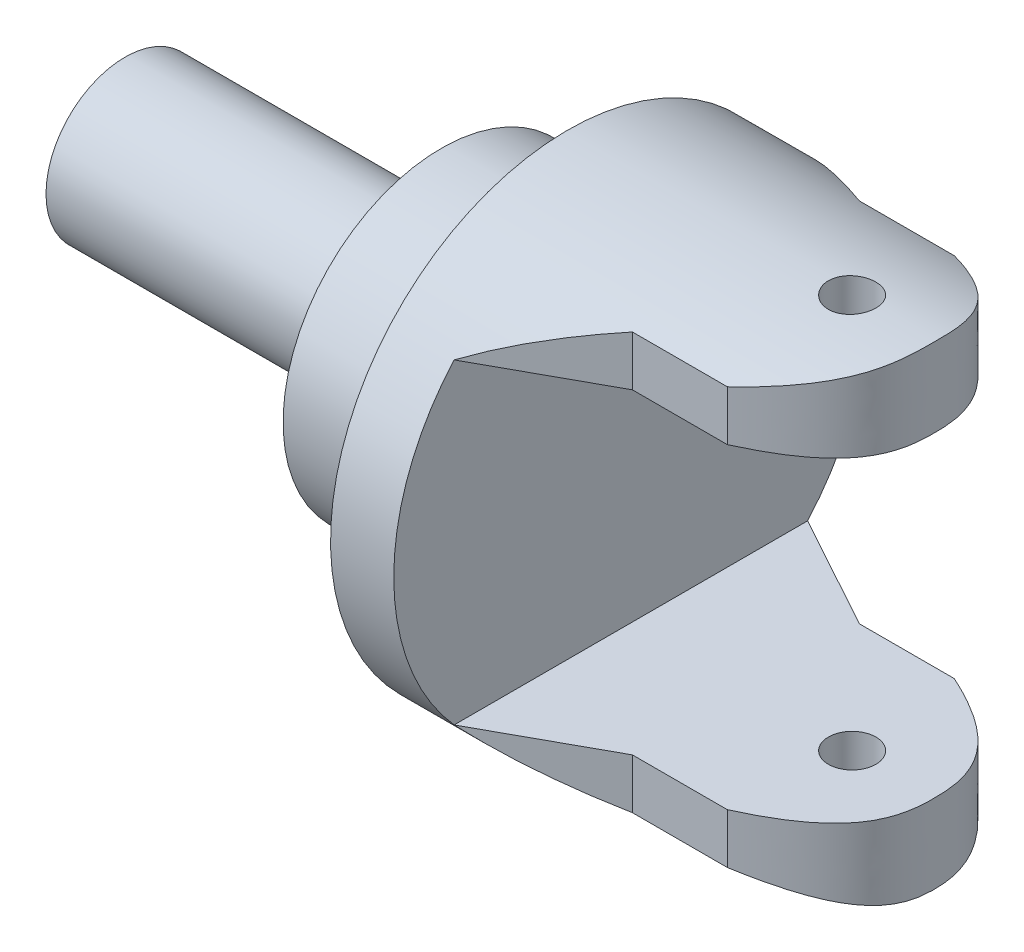
ISO-10303-21;
HEADER;
FILE_DESCRIPTION(('STEP AP214'),'2;1');
FILE_NAME('part.step','',(''),(''),'','','');
FILE_SCHEMA(('AUTOMOTIVE_DESIGN { 1 0 10303 214 1 1 1 1 }'));
ENDSEC;
DATA;
#1=APPLICATION_CONTEXT('core data for automotive mechanical design processes');
#2=APPLICATION_PROTOCOL_DEFINITION('international standard','automotive_design',2000,#1);
#3=PRODUCT_CONTEXT('',#1,'mechanical');
#4=PRODUCT('Part','Part','',(#3));
#5=PRODUCT_RELATED_PRODUCT_CATEGORY('part','',(#4));
#6=PRODUCT_DEFINITION_FORMATION('','',#4);
#7=PRODUCT_DEFINITION_CONTEXT('part definition',#1,'design');
#8=PRODUCT_DEFINITION('design','',#6,#7);
#9=PRODUCT_DEFINITION_SHAPE('','',#8);
#10=(LENGTH_UNIT() NAMED_UNIT(*) SI_UNIT(.MILLI.,.METRE.));
#11=(NAMED_UNIT(*) PLANE_ANGLE_UNIT() SI_UNIT($,.RADIAN.));
#12=(NAMED_UNIT(*) SI_UNIT($,.STERADIAN.) SOLID_ANGLE_UNIT());
#13=UNCERTAINTY_MEASURE_WITH_UNIT(LENGTH_MEASURE(1.E-05),#10,'distance_accuracy_value','');
#14=(GEOMETRIC_REPRESENTATION_CONTEXT(3) GLOBAL_UNCERTAINTY_ASSIGNED_CONTEXT((#13)) GLOBAL_UNIT_ASSIGNED_CONTEXT((#10,
#11,#12)) REPRESENTATION_CONTEXT('',''));
#15=CARTESIAN_POINT('',(0.,0.,0.));
#16=DIRECTION('',(0.,0.,1.));
#17=DIRECTION('',(1.,0.,0.));
#18=AXIS2_PLACEMENT_3D('',#15,#16,#17);
#19=CARTESIAN_POINT('',(4.,0.,0.));
#20=DIRECTION('',(-1.,0.,0.));
#21=DIRECTION('',(0.,0.,1.));
#22=AXIS2_PLACEMENT_3D('',#19,#20,#21);
#23=CYLINDRICAL_SURFACE('',#22,5.);
#24=CARTESIAN_POINT('',(4.,0.,0.));
#25=DIRECTION('',(1.,0.,0.));
#26=DIRECTION('',(0.,0.,-1.));
#27=AXIS2_PLACEMENT_3D('',#24,#25,#26);
#28=CIRCLE('',#27,5.);
#29=CARTESIAN_POINT('',(4.,0.,-5.));
#30=VERTEX_POINT('',#29);
#31=EDGE_CURVE('E175',#30,#30,#28,.T.);
#32=ORIENTED_EDGE('',*,*,#31,.F.);
#33=EDGE_LOOP('',(#32));
#34=FACE_BOUND('',#33,.T.);
#35=CARTESIAN_POINT('',(0.,0.,0.));
#36=DIRECTION('',(1.,0.,0.));
#37=DIRECTION('',(0.,0.,-1.));
#38=AXIS2_PLACEMENT_3D('',#35,#36,#37);
#39=CIRCLE('',#38,5.);
#40=CARTESIAN_POINT('',(0.,0.,-5.));
#41=VERTEX_POINT('',#40);
#42=EDGE_CURVE('E173',#41,#41,#39,.T.);
#43=ORIENTED_EDGE('',*,*,#42,.T.);
#44=EDGE_LOOP('',(#43));
#45=FACE_BOUND('',#44,.T.);
#46=ADVANCED_FACE('F41',(#34,#45),#23,.T.);
#47=CARTESIAN_POINT('',(0.,0.,0.));
#48=DIRECTION('',(1.,0.,0.));
#49=DIRECTION('',(0.,0.,-1.));
#50=AXIS2_PLACEMENT_3D('',#47,#48,#49);
#51=PLANE('',#50);
#52=CARTESIAN_POINT('',(0.,0.,0.));
#53=DIRECTION('',(-1.,0.,0.));
#54=DIRECTION('',(0.,0.,1.));
#55=AXIS2_PLACEMENT_3D('',#52,#53,#54);
#56=CIRCLE('',#55,2.5);
#57=CARTESIAN_POINT('',(0.,0.,2.5));
#58=VERTEX_POINT('',#57);
#59=EDGE_CURVE('E11',#58,#58,#56,.T.);
#60=ORIENTED_EDGE('',*,*,#59,.F.);
#61=EDGE_LOOP('',(#60));
#62=FACE_BOUND('',#61,.T.);
#63=ORIENTED_EDGE('',*,*,#42,.F.);
#64=EDGE_LOOP('',(#63));
#65=FACE_BOUND('',#64,.T.);
#66=ADVANCED_FACE('F316',(#62,#65),#51,.F.);
#67=CARTESIAN_POINT('',(6.,0.,0.));
#68=DIRECTION('',(-1.,0.,0.));
#69=DIRECTION('',(0.,0.,1.));
#70=AXIS2_PLACEMENT_3D('',#67,#68,#69);
#71=CYLINDRICAL_SURFACE('',#70,7.5);
#72=CARTESIAN_POINT('',(12.25,7.5,0.));
#73=CARTESIAN_POINT('',(12.2500018194253,7.49999951640577,-0.0420152653436679));
#74=CARTESIAN_POINT('',(12.2535424516723,7.49964319197154,-0.0840583088758299));
#75=CARTESIAN_POINT('',(12.2676132777178,7.49825600696053,-0.166978798872628));
#76=CARTESIAN_POINT('',(12.2781511720184,7.49722440325519,-0.207854909376621));
#77=CARTESIAN_POINT('',(12.3059066804484,7.49460310922303,-0.287228756590061));
#78=CARTESIAN_POINT('',(12.3231202603889,7.49301375600531,-0.325727913461183));
#79=CARTESIAN_POINT('',(12.3637306809487,7.4894546804573,-0.399282120720305));
#80=CARTESIAN_POINT('',(12.3871262920001,7.48748503378599,-0.434337854084308));
#81=CARTESIAN_POINT('',(12.4395270232467,7.48337808255993,-0.500144663005562));
#82=CARTESIAN_POINT('',(12.4685498495515,7.48124026180399,-0.53088160862617));
#83=CARTESIAN_POINT('',(12.5313434006973,7.47704217679697,-0.587056891073239));
#84=CARTESIAN_POINT('',(12.5651143450318,7.47498191613688,-0.61249498281199));
#85=CARTESIAN_POINT('',(12.6365338987627,7.47116693664588,-0.657400477832713));
#86=CARTESIAN_POINT('',(12.6741905830711,7.46941287533179,-0.67685509909116));
#87=CARTESIAN_POINT('',(12.7522566894287,7.46641528159893,-0.70915978855707));
#88=CARTESIAN_POINT('',(12.792666043438,7.46517173656667,-0.722010019943469));
#89=CARTESIAN_POINT('',(12.8749463506495,7.46334063054733,-0.74069928120142));
#90=CARTESIAN_POINT('',(12.9168119326392,7.46275087798572,-0.746561739752847));
#91=CARTESIAN_POINT('',(13.0009366475468,7.46228732295394,-0.751181463851521));
#92=CARTESIAN_POINT('',(13.0431957700915,7.46241350166559,-0.749938916153101));
#93=CARTESIAN_POINT('',(13.12674648227,7.46336555174201,-0.740403210189509));
#94=CARTESIAN_POINT('',(13.1680410244965,7.46418888442988,-0.732135633093414));
#95=CARTESIAN_POINT('',(13.2486534724008,7.46643850715564,-0.708824358112941));
#96=CARTESIAN_POINT('',(13.2879713513688,7.46786480533869,-0.69378056869181));
#97=CARTESIAN_POINT('',(13.3635951904742,7.47116257089053,-0.657315670411131));
#98=CARTESIAN_POINT('',(13.399895642117,7.47303482931118,-0.635883212039985));
#99=CARTESIAN_POINT('',(13.4683939111839,7.47701288799659,-0.587257520514921));
#100=CARTESIAN_POINT('',(13.5005916084863,7.47911869509588,-0.560064118752379));
#101=CARTESIAN_POINT('',(13.5601190454918,7.48333788984742,-0.500545584309051));
#102=CARTESIAN_POINT('',(13.5874267014106,7.48545126999748,-0.468198359138522));
#103=CARTESIAN_POINT('',(13.6362277246828,7.48943871808889,-0.399367111302834));
#104=CARTESIAN_POINT('',(13.6577210855174,7.49131278576192,-0.362883083999701));
#105=CARTESIAN_POINT('',(13.6942825152327,7.49461106750322,-0.286798579269273));
#106=CARTESIAN_POINT('',(13.7093494636135,7.49603520311077,-0.247197559792427));
#107=CARTESIAN_POINT('',(13.7326141875338,7.49827235581056,-0.166010412997449));
#108=CARTESIAN_POINT('',(13.740812168493,7.49908539117797,-0.12442434508245));
#109=CARTESIAN_POINT('',(13.7500782308011,7.50000638751233,-0.0406388243189272));
#110=CARTESIAN_POINT('',(13.7511767861894,7.50011736200802,0.00155722657911946));
#111=CARTESIAN_POINT('',(13.7462928527134,7.49962981317598,0.085532844986775));
#112=CARTESIAN_POINT('',(13.7403104595135,7.49903129943351,0.127312418115353));
#113=CARTESIAN_POINT('',(13.7214597284338,7.49719396154395,0.209181155126006));
#114=CARTESIAN_POINT('',(13.7086056591415,7.49595646438529,0.249273636729014));
#115=CARTESIAN_POINT('',(13.676391119472,7.49297999145457,0.326733241037836));
#116=CARTESIAN_POINT('',(13.6570305032205,7.4912410044394,0.364100302617838));
#117=CARTESIAN_POINT('',(13.6122768710021,7.48744856497817,0.435186135129107));
#118=CARTESIAN_POINT('',(13.5868638333056,7.48539407702581,0.468892244811687));
#119=CARTESIAN_POINT('',(13.5307554491943,7.4812044965214,0.531571217483908));
#120=CARTESIAN_POINT('',(13.5000599701973,7.47906940194729,0.560543961636882));
#121=CARTESIAN_POINT('',(13.4341250690057,7.47495018105566,0.613039582415359));
#122=CARTESIAN_POINT('',(13.398869682593,7.47296662604231,0.636542459009657));
#123=CARTESIAN_POINT('',(13.32489447989,7.46938374345667,0.677293694057871));
#124=CARTESIAN_POINT('',(13.2861747109837,7.46778441063028,0.694542138040412));
#125=CARTESIAN_POINT('',(13.2064384454007,7.46515460725537,0.722261406513357));
#126=CARTESIAN_POINT('',(13.1654261199317,7.46412313837341,0.732744131108896));
#127=CARTESIAN_POINT('',(13.0822126015294,7.46274273962157,0.746673005347097));
#128=CARTESIAN_POINT('',(13.0400114427282,7.4623937901764,0.750119356799638));
#129=CARTESIAN_POINT('',(12.9558169837325,7.46241834830672,0.749874853853442));
#130=CARTESIAN_POINT('',(12.9138235878379,7.46278867565257,0.746215417194834));
#131=CARTESIAN_POINT('',(12.8310513121238,7.46420327917159,0.73192908972274));
#132=CARTESIAN_POINT('',(12.7902724336705,7.46524755610289,0.72130219107162));
#133=CARTESIAN_POINT('',(12.7110869882141,7.4678915119739,0.693391264723127));
#134=CARTESIAN_POINT('',(12.6726800937777,7.46949111405271,0.676108158255687));
#135=CARTESIAN_POINT('',(12.5993073312467,7.47306563879519,0.635378666183282));
#136=CARTESIAN_POINT('',(12.5643414438845,7.47504055935713,0.611932315091561));
#137=CARTESIAN_POINT('',(12.498682244146,7.47915365407273,0.559423917213999));
#138=CARTESIAN_POINT('',(12.4680076927247,7.48129248545063,0.530338461667703));
#139=CARTESIAN_POINT('',(12.4119608254753,7.48548641046587,0.467423774418834));
#140=CARTESIAN_POINT('',(12.3865897814821,7.48754148392232,0.433593408081193));
#141=CARTESIAN_POINT('',(12.341819909609,7.49134171551871,0.362056075620967));
#142=CARTESIAN_POINT('',(12.3224362817911,7.49308608020109,0.324339562010073));
#143=CARTESIAN_POINT('',(12.2903031828821,7.49605971937422,0.246193709325413));
#144=CARTESIAN_POINT('',(12.2775462317848,7.4972895743224,0.205767487369207));
#145=CARTESIAN_POINT('',(12.2622095371864,7.498786603303,0.137593696054278));
#146=CARTESIAN_POINT('',(12.2576372167755,7.49923950518874,0.110281914633382));
#147=CARTESIAN_POINT('',(12.2515318554537,7.49984636213089,0.0553174356129847));
#148=CARTESIAN_POINT('',(12.2499988020086,7.50000031842018,0.0276647394199184));
#149=CARTESIAN_POINT('',(12.25,7.5,0.));
#150=B_SPLINE_CURVE_WITH_KNOTS('',3,(#72,#73,#74,#75,#76,#77,#78,#79,#80,#81,#82,#83,#84,#85,
#86,#87,#88,#89,#90,#91,#92,#93,#94,#95,#96,#97,#98,#99,#100,#101,#102,#103,#104,#105,#106,#107,
#108,#109,#110,#111,#112,#113,#114,#115,#116,#117,#118,#119,#120,#121,#122,#123,#124,#125,#126,
#127,#128,#129,#130,#131,#132,#133,#134,#135,#136,#137,#138,#139,#140,#141,#142,#143,#144,#145,
#146,#147,#148,#149),.UNSPECIFIED.,.T.,.F.,(4,2,2,2,2,2,2,2,2,2,2,2,2,2,2,2,2,2,2,2,2,2,2,2,2,2,
2,2,2,2,2,2,2,2,2,2,2,2,4),(0.,0.125944774701355,0.252028382126615,0.378035914299152,
0.504018403187087,0.630403926467209,0.756795294155294,0.883454816041664,1.01011120831878,
1.13634174033898,1.26256895441833,1.38833848080833,1.51410970621225,1.64010571029671,
1.76610540248344,1.89266050647155,2.01921575234829,2.14579305520186,2.2723665725658,
2.39839641455818,2.52442455389358,2.65019201470729,2.775962295371,2.90215455561524,
3.02834998357673,3.15499982706449,3.28164793856531,3.40807267944753,3.53449379429689,
3.66035721970467,3.7862207866953,3.912066940221,4.0379123890422,4.1642918807074,
4.29070164477718,4.41742973269682,4.54401446096471,4.62694250424262,4.7098702055177),.UNSPECIFIED.);
#151=CARTESIAN_POINT('',(12.25,7.5,0.));
#152=VERTEX_POINT('',#151);
#153=EDGE_CURVE('E249',#152,#152,#150,.T.);
#154=ORIENTED_EDGE('',*,*,#153,.T.);
#155=EDGE_LOOP('',(#154));
#156=FACE_BOUND('',#155,.T.);
#157=CARTESIAN_POINT('',(13.,-7.46240577829965,-0.75));
#158=CARTESIAN_POINT('',(12.9579853268698,-7.46240627097677,-0.749998180045134));
#159=CARTESIAN_POINT('',(12.9159428736911,-7.46276442745664,-0.746457644236857));
#160=CARTESIAN_POINT('',(12.8330236102798,-7.46415815668589,-0.732387236072672));
#161=CARTESIAN_POINT('',(12.7921481364719,-7.46519447595914,-0.721849661164827));
#162=CARTESIAN_POINT('',(12.7127756355866,-7.4678259978554,-0.694095087051695));
#163=CARTESIAN_POINT('',(12.6742771829564,-7.46942086160092,-0.676882137220424));
#164=CARTESIAN_POINT('',(12.6007241557812,-7.47298935428865,-0.636273200543325));
#165=CARTESIAN_POINT('',(12.5656688991372,-7.47496290798247,-0.612878441719444));
#166=CARTESIAN_POINT('',(12.4998615522569,-7.47907445032424,-0.560478571499028));
#167=CARTESIAN_POINT('',(12.4691237428722,-7.48121295003949,-0.531455563581195));
#168=CARTESIAN_POINT('',(12.4129467932473,-7.48540878926789,-0.468661286489674));
#169=CARTESIAN_POINT('',(12.3875078954453,-7.4874661250641,-0.434889800179927));
#170=CARTESIAN_POINT('',(12.3426015572446,-7.49127287366704,-0.363469771238241));
#171=CARTESIAN_POINT('',(12.3231467509047,-7.49302163170985,-0.325813246897177));
#172=CARTESIAN_POINT('',(12.2908416751385,-7.49600862656828,-0.247747488215632));
#173=CARTESIAN_POINT('',(12.2779912447229,-7.49724687582798,-0.207338321001164));
#174=CARTESIAN_POINT('',(12.2593015679851,-7.49906974928269,-0.125058587057212));
#175=CARTESIAN_POINT('',(12.2534388754375,-7.49965655882113,-0.083193395273686));
#176=CARTESIAN_POINT('',(12.2488185481497,-7.50011786699019,0.000930555516706989));
#177=CARTESIAN_POINT('',(12.2500607291903,-7.49999238408954,0.0431893042908455));
#178=CARTESIAN_POINT('',(12.2595958544876,-7.49904503483389,0.12674163304842));
#179=CARTESIAN_POINT('',(12.2678635866729,-7.49822565863784,0.168038122451234));
#180=CARTESIAN_POINT('',(12.29117584671,-7.49598546948698,0.2486543846284));
#181=CARTESIAN_POINT('',(12.3062204625907,-7.49456464871965,0.287974131718296));
#182=CARTESIAN_POINT('',(12.3426870724408,-7.49127703112937,0.363600236009689));
#183=CARTESIAN_POINT('',(12.3641202231476,-7.48940945524318,0.399901178236237));
#184=CARTESIAN_POINT('',(12.4127473925023,-7.48543788389556,0.468400134880645));
#185=CARTESIAN_POINT('',(12.4399415801089,-7.48333388150108,0.500598028920621));
#186=CARTESIAN_POINT('',(12.4994606721352,-7.47911470100888,0.560124578867017));
#187=CARTESIAN_POINT('',(12.5318075085562,-7.47699951429771,0.587431309642758));
#188=CARTESIAN_POINT('',(12.6006376489081,-7.47300554946167,0.636230651518438));
#189=CARTESIAN_POINT('',(12.6371209588391,-7.47112677167973,0.657723254184668));
#190=CARTESIAN_POINT('',(12.7132052688998,-7.46781817135612,0.694284138429923));
#191=CARTESIAN_POINT('',(12.7528069243172,-7.46638844349416,0.70935106542972));
#192=CARTESIAN_POINT('',(12.833995453461,-7.46414176403203,0.732615551728192));
#193=CARTESIAN_POINT('',(12.8755822666656,-7.46332479376326,0.740813320307275));
#194=CARTESIAN_POINT('',(12.9593681346471,-7.46239935395563,0.75007858154397));
#195=CARTESIAN_POINT('',(13.0015637651986,-7.46228783660702,0.751176747485409));
#196=CARTESIAN_POINT('',(13.0855384493671,-7.46277788516079,0.746292185153522));
#197=CARTESIAN_POINT('',(13.1273175086053,-7.46337944142796,0.740309552557316));
#198=CARTESIAN_POINT('',(13.2091836867088,-7.46522508316801,0.72145888088064));
#199=CARTESIAN_POINT('',(13.249274178321,-7.46646781501009,0.708605345391682));
#200=CARTESIAN_POINT('',(13.3267300387977,-7.46945468279096,0.676392539756955));
#201=CARTESIAN_POINT('',(13.3640953452154,-7.47119883021502,0.657033120587692));
#202=CARTESIAN_POINT('',(13.4351799805216,-7.47499938266785,0.612281251067414));
#203=CARTESIAN_POINT('',(13.4688864564747,-7.47705683111004,0.586868474880519));
#204=CARTESIAN_POINT('',(13.5315662899555,-7.4812487446889,0.530760400088381));
#205=CARTESIAN_POINT('',(13.5605395302551,-7.48338321173149,0.500064970686102));
#206=CARTESIAN_POINT('',(13.6130362250486,-7.48749785886976,0.434129853169856));
#207=CARTESIAN_POINT('',(13.6365396696897,-7.48947745541606,0.398874191977089));
#208=CARTESIAN_POINT('',(13.6772919013798,-7.49305081579973,0.324898288062849));
#209=CARTESIAN_POINT('',(13.6945407741303,-7.49464458492369,0.28617809282222));
#210=CARTESIAN_POINT('',(13.7222603257415,-7.49726407810504,0.206442094824612));
#211=CARTESIAN_POINT('',(13.7327430904939,-7.49829081454236,0.16543052823747));
#212=CARTESIAN_POINT('',(13.7466723021849,-7.49966470960237,0.0822186104877596));
#213=CARTESIAN_POINT('',(13.7501189468755,-7.50001188732422,0.0400182927691635));
#214=CARTESIAN_POINT('',(13.74987530017,-7.49998753734952,-0.0441766680568095));
#215=CARTESIAN_POINT('',(13.7462160723725,-7.49961913782502,-0.0861714054183955));
#216=CARTESIAN_POINT('',(13.7319296907573,-7.49821120183193,-0.168946416267272));
#217=CARTESIAN_POINT('',(13.7213025314703,-7.49717166483655,-0.209726688801274));
#218=CARTESIAN_POINT('',(13.6933905569553,-7.49453792860471,-0.288914931575807));
#219=CARTESIAN_POINT('',(13.6761066497994,-7.49294380502437,-0.327323224558146));
#220=CARTESIAN_POINT('',(13.6353751233123,-7.48937859312222,-0.400698450116097));
#221=CARTESIAN_POINT('',(13.6119275400467,-7.48740750700616,-0.435665402826419));
#222=CARTESIAN_POINT('',(13.5594177857322,-7.48329888501791,-0.501324543320203));
#223=CARTESIAN_POINT('',(13.5303324878164,-7.48116068595524,-0.531998194664505));
#224=CARTESIAN_POINT('',(13.4674184863409,-7.47696443077244,-0.588043319544857));
#225=CARTESIAN_POINT('',(13.4335886461232,-7.47490639400833,-0.613413518885886));
#226=CARTESIAN_POINT('',(13.3620517435601,-7.47109787557951,-0.65818248031804));
#227=CARTESIAN_POINT('',(13.324335039007,-7.4693481894398,-0.677565890996126));
#228=CARTESIAN_POINT('',(13.2461887815653,-7.46636396071846,-0.709698531074077));
#229=CARTESIAN_POINT('',(13.2057623470557,-7.46512883740019,-0.722455243417394));
#230=CARTESIAN_POINT('',(13.1375891943257,-7.46362505653609,-0.737791266250148));
#231=CARTESIAN_POINT('',(13.1102783115202,-7.4631699895177,-0.742363284298669));
#232=CARTESIAN_POINT('',(13.0553156327181,-7.46256018883247,-0.748468243953836));
#233=CARTESIAN_POINT('',(13.0276638381531,-7.46240545390488,-0.750001198317948));
#234=CARTESIAN_POINT('',(13.,-7.46240577829965,-0.75));
#235=B_SPLINE_CURVE_WITH_KNOTS('',3,(#157,#158,#159,#160,#161,#162,#163,#164,#165,#166,#167,
#168,#169,#170,#171,#172,#173,#174,#175,#176,#177,#178,#179,#180,#181,#182,#183,#184,#185,#186,
#187,#188,#189,#190,#191,#192,#193,#194,#195,#196,#197,#198,#199,#200,#201,#202,#203,#204,#205,
#206,#207,#208,#209,#210,#211,#212,#213,#214,#215,#216,#217,#218,#219,#220,#221,#222,#223,#224,
#225,#226,#227,#228,#229,#230,#231,#232,#233,#234),.UNSPECIFIED.,.T.,.F.,(4,2,2,2,2,2,2,2,2,2,2,
2,2,2,2,2,2,2,2,2,2,2,2,2,2,2,2,2,2,2,2,2,2,2,2,2,2,2,4),(0.,0.125942995827346,
0.252024863866327,0.378030368248106,0.504010860315985,0.630398711474438,0.756792343914397,
0.883451024784688,1.01010661805846,1.13633603173837,1.26256217248674,1.38833723863996,
1.51411393860731,1.6401115909981,1.76611293913897,1.89266568813751,2.01921862070672,
2.1457982183845,2.27237395946275,2.39840247230824,2.52442928225153,2.65019111028395,
2.77595581920785,2.90214892358789,3.02834515292402,3.15499602613589,3.28164516388504,
3.40806744520771,3.53448617334862,3.66035350101362,3.78622092747494,3.91207118996435,
4.03792071608099,4.16429786278491,4.29070533775894,4.41743430802858,4.54401986170501,
4.62694520704535,4.70987020427862),.UNSPECIFIED.);
#236=CARTESIAN_POINT('',(13.,-7.46240577829965,-0.75));
#237=VERTEX_POINT('',#236);
#238=EDGE_CURVE('E351',#237,#237,#235,.T.);
#239=ORIENTED_EDGE('',*,*,#238,.T.);
#240=EDGE_LOOP('',(#239));
#241=FACE_BOUND('',#240,.T.);
#242=CARTESIAN_POINT('',(6.,0.,0.));
#243=DIRECTION('',(1.,0.,0.));
#244=DIRECTION('',(0.,0.,-1.));
#245=AXIS2_PLACEMENT_3D('',#242,#243,#244);
#246=CIRCLE('',#245,7.5);
#247=CARTESIAN_POINT('',(6.,-5.,-5.59016994374947));
#248=VERTEX_POINT('',#247);
#249=CARTESIAN_POINT('',(6.,5.,-5.59016994374947));
#250=VERTEX_POINT('',#249);
#251=EDGE_CURVE('E140',#248,#250,#246,.T.);
#252=ORIENTED_EDGE('',*,*,#251,.F.);
#253=CARTESIAN_POINT('',(16.1752296428108,0.,0.));
#254=DIRECTION('',(-0.481508267983438,0.,0.876441548458076));
#255=DIRECTION('',(-0.876441548458076,0.,-0.481508267983438));
#256=AXIS2_PLACEMENT_3D('',#253,#254,#255);
#257=ELLIPSE('',#256,15.576056526319,7.5);
#258=CARTESIAN_POINT('',(9.64040082687935,-6.58488266979738,-3.59016994374948));
#259=VERTEX_POINT('',#258);
#260=EDGE_CURVE('E131',#248,#259,#257,.T.);
#261=ORIENTED_EDGE('',*,*,#260,.T.);
#262=DIRECTION('',(-1.,0.,0.));
#263=VECTOR('',#262,1.);
#264=CARTESIAN_POINT('',(6.,-6.58488266979738,-3.59016994374948));
#265=LINE('',#264,#263);
#266=CARTESIAN_POINT('',(12.6404008268793,-6.58488266979738,-3.59016994374947));
#267=VERTEX_POINT('',#266);
#268=EDGE_CURVE('E227',#259,#267,#265,.F.);
#269=ORIENTED_EDGE('',*,*,#268,.T.);
#270=CARTESIAN_POINT('',(12.6404008268793,-6.58488266979738,-3.59016994374947));
#271=CARTESIAN_POINT('',(12.7437502964993,-6.61042953184387,-3.54329687920745));
#272=CARTESIAN_POINT('',(12.8465061395303,-6.63605668998682,-3.49511799905254));
#273=CARTESIAN_POINT('',(13.0509192282611,-6.68757166442575,-3.39552259466111));
#274=CARTESIAN_POINT('',(13.1525701925339,-6.71346011990631,-3.34409353310088));
#275=CARTESIAN_POINT('',(13.3541627870818,-6.76542782568062,-3.23766760937976));
#276=CARTESIAN_POINT('',(13.4541014675715,-6.7915073125485,-3.1826652464046));
#277=CARTESIAN_POINT('',(13.6550273738187,-6.84468848000512,-3.06666826111343));
#278=CARTESIAN_POINT('',(13.7559325471071,-6.87179448131184,-3.00553264615951));
#279=CARTESIAN_POINT('',(13.954402426173,-6.92603893948513,-2.87832602792812));
#280=CARTESIAN_POINT('',(14.0519712008401,-6.95317731176674,-2.8122613734515));
#281=CARTESIAN_POINT('',(14.2428612587281,-7.00737397966512,-2.67435941121232));
#282=CARTESIAN_POINT('',(14.3361864999637,-7.03443232693904,-2.60252766299997));
#283=CARTESIAN_POINT('',(14.4930696849333,-7.08104910962562,-2.47227742183988));
#284=CARTESIAN_POINT('',(14.5579033339188,-7.10067444977119,-2.41542210485215));
#285=CARTESIAN_POINT('',(14.6839634129233,-7.13963307067604,-2.29771291584725));
#286=CARTESIAN_POINT('',(14.7451895559315,-7.15896632810668,-2.236858726495));
#287=CARTESIAN_POINT('',(14.8627184266545,-7.19697698050301,-2.11134688338714));
#288=CARTESIAN_POINT('',(14.9190577587563,-7.21565848364918,-2.04672493878929));
#289=CARTESIAN_POINT('',(15.0264485959924,-7.25225972151864,-1.91299005210048));
#290=CARTESIAN_POINT('',(15.0775004329477,-7.27017950400265,-1.84387739227143));
#291=CARTESIAN_POINT('',(15.1579131514629,-7.29931421039933,-1.72409265824355));
#292=CARTESIAN_POINT('',(15.1889729746657,-7.31083343993227,-1.67463059565059));
#293=CARTESIAN_POINT('',(15.2479075879551,-7.33322377596944,-1.57369024092183));
#294=CARTESIAN_POINT('',(15.2757821883354,-7.34409484385188,-1.52221182894069));
#295=CARTESIAN_POINT('',(15.3280883423596,-7.36504518722325,-1.41737990228618));
#296=CARTESIAN_POINT('',(15.3525200820786,-7.37512450549058,-1.36402648914527));
#297=CARTESIAN_POINT('',(15.3978226024519,-7.39437149226366,-1.25551316255602));
#298=CARTESIAN_POINT('',(15.4186847026686,-7.40353691647339,-1.20034922360103));
#299=CARTESIAN_POINT('',(15.4567090916575,-7.42079271166206,-1.08859181458878));
#300=CARTESIAN_POINT('',(15.4738710375104,-7.4288829829724,-1.03199821257715));
#301=CARTESIAN_POINT('',(15.5045439403983,-7.44386562147412,-0.917706623828054));
#302=CARTESIAN_POINT('',(15.5180565075474,-7.4507585164701,-0.860009136199221));
#303=CARTESIAN_POINT('',(15.543413408698,-7.46420592264841,-0.734956063091472));
#304=CARTESIAN_POINT('',(15.5546933128031,-7.47055030887884,-0.667463668650721));
#305=CARTESIAN_POINT('',(15.5731388869705,-7.48143558050657,-0.531751894527412));
#306=CARTESIAN_POINT('',(15.5803023619807,-7.48597550329146,-0.463532146700536));
#307=CARTESIAN_POINT('',(15.5911225780976,-7.49319610452447,-0.326669060636748));
#308=CARTESIAN_POINT('',(15.594776311109,-7.49587518755868,-0.258025409699161));
#309=CARTESIAN_POINT('',(15.5993076833399,-7.49935076013459,-0.120390812670221));
#310=CARTESIAN_POINT('',(15.6001763954922,-7.50014119376792,-0.0513994583479522));
#311=CARTESIAN_POINT('',(15.5997771856746,-7.49981765156253,0.0865369093141591));
#312=CARTESIAN_POINT('',(15.5985104262627,-7.49870471192203,0.155481927439928));
#313=CARTESIAN_POINT('',(15.593020290942,-7.49458370750573,0.293185402302513));
#314=CARTESIAN_POINT('',(15.5887978992169,-7.49157627360318,0.361943913494778));
#315=CARTESIAN_POINT('',(15.5758750545693,-7.48314799335344,0.508528560297328));
#316=CARTESIAN_POINT('',(15.5666361818759,-7.47745095936411,0.586294017197834));
#317=CARTESIAN_POINT('',(15.5425594606179,-7.46373275746469,0.740743714378468));
#318=CARTESIAN_POINT('',(15.5277230866753,-7.45571220179896,0.817428233909197));
#319=CARTESIAN_POINT('',(15.4919772917626,-7.43757921402668,0.968592778803382));
#320=CARTESIAN_POINT('',(15.4711082820523,-7.42748082651022,1.0430839529346));
#321=CARTESIAN_POINT('',(15.423040245939,-7.40540962263928,1.18970822872291));
#322=CARTESIAN_POINT('',(15.395841686644,-7.39343694462496,1.26184150394036));
#323=CARTESIAN_POINT('',(15.3351959529627,-7.36789276100867,1.40333116571049));
#324=CARTESIAN_POINT('',(15.3017347841653,-7.35431770031806,1.47268090226139));
#325=CARTESIAN_POINT('',(15.2290613728842,-7.32591733102231,1.60801697722201));
#326=CARTESIAN_POINT('',(15.1898490809137,-7.31109201165952,1.6740032866838));
#327=CARTESIAN_POINT('',(15.1061305357729,-7.28043279257578,1.80269111949407));
#328=CARTESIAN_POINT('',(15.0616018837399,-7.26459476615326,1.8653770179871));
#329=CARTESIAN_POINT('',(14.9680872521241,-7.23223205038587,1.98715620731371));
#330=CARTESIAN_POINT('',(14.919099581631,-7.21570710185381,2.04624812097821));
#331=CARTESIAN_POINT('',(14.7846720358738,-7.1714224252723,2.1978054370139));
#332=CARTESIAN_POINT('',(14.6960326198465,-7.14326541911715,2.28732206863992));
#333=CARTESIAN_POINT('',(14.5111949539966,-7.08635751256202,2.45797362586352));
#334=CARTESIAN_POINT('',(14.4149908209623,-7.05760616299873,2.53910191189383));
#335=CARTESIAN_POINT('',(14.2166781183477,-6.99980928586845,2.69435497053528));
#336=CARTESIAN_POINT('',(14.1145510527573,-6.97076309944983,2.7684556635811));
#337=CARTESIAN_POINT('',(13.9061258414689,-6.91269426538328,2.91041848544587));
#338=CARTESIAN_POINT('',(13.7998289561194,-6.88367161328811,2.97828247892072));
#339=CARTESIAN_POINT('',(13.606914973419,-6.8318920225239,3.09490011031954));
#340=CARTESIAN_POINT('',(13.5209038616589,-6.80911131164314,3.14465480034326));
#341=CARTESIAN_POINT('',(13.3472473241773,-6.7636520103508,3.241274717364));
#342=CARTESIAN_POINT('',(13.2596018569516,-6.74097342255083,3.28813987085104));
#343=CARTESIAN_POINT('',(13.0839690611193,-6.69598961307869,3.37879530490676));
#344=CARTESIAN_POINT('',(12.9959968951686,-6.67368307471738,3.42261444094017));
#345=CARTESIAN_POINT('',(12.8189671341711,-6.62919218110816,3.50800673879782));
#346=CARTESIAN_POINT('',(12.7299098308633,-6.60700779525084,3.54958048864826));
#347=CARTESIAN_POINT('',(12.6404008268794,-6.58488266979738,3.59016994374947));
#348=B_SPLINE_CURVE_WITH_KNOTS('',3,(#270,#271,#272,#273,#274,#275,#276,#277,#278,#279,#280,
#281,#282,#283,#284,#285,#286,#287,#288,#289,#290,#291,#292,#293,#294,#295,#296,#297,#298,#299,
#300,#301,#302,#303,#304,#305,#306,#307,#308,#309,#310,#311,#312,#313,#314,#315,#316,#317,#318,
#319,#320,#321,#322,#323,#324,#325,#326,#327,#328,#329,#330,#331,#332,#333,#334,#335,#336,#337,
#338,#339,#340,#341,#342,#343,#344,#345,#346,#347),.UNSPECIFIED.,.F.,.F.,(4,2,2,2,2,2,2,2,2,2,2,
2,2,2,2,2,2,2,2,2,2,2,2,2,2,2,2,2,2,2,2,2,2,2,2,2,2,2,4),(0.,0.348982151413442,
0.699404079755185,1.05037885943645,1.41341867492936,1.7759986955997,2.13823328747256,
2.40340799948216,2.66860378020656,2.9316012924409,3.19458229004459,3.37306529718049,
3.55155892891847,3.73004290996391,3.9089549327294,4.08788352940543,4.26673305293467,
4.47272631708294,4.67882932376406,4.88510881800675,5.09204886000668,5.29887627950961,
5.50563486113935,5.74097973075342,5.97626264367765,6.21000459301487,6.44372929813863,
6.67798265836751,6.91223803439797,7.14751772554296,7.38288701210467,7.7694684880957,
8.15635364672075,8.54451986140578,8.93256964153646,9.23834227142412,9.54412267697718,
9.84643354781273,10.1486648611278),.UNSPECIFIED.);
#349=CARTESIAN_POINT('',(12.6404008268794,-6.58488266979738,3.59016994374947));
#350=VERTEX_POINT('',#349);
#351=EDGE_CURVE('E276',#267,#350,#348,.T.);
#352=ORIENTED_EDGE('',*,*,#351,.T.);
#353=DIRECTION('',(-1.,0.,0.));
#354=VECTOR('',#353,1.);
#355=CARTESIAN_POINT('',(6.,-6.58488266979738,3.59016994374947));
#356=LINE('',#355,#354);
#357=CARTESIAN_POINT('',(9.64040082687935,-6.58488266979738,3.59016994374947));
#358=VERTEX_POINT('',#357);
#359=EDGE_CURVE('E210',#350,#358,#356,.T.);
#360=ORIENTED_EDGE('',*,*,#359,.T.);
#361=CARTESIAN_POINT('',(16.1752296428108,0.,0.));
#362=DIRECTION('',(-0.481508267983438,0.,-0.876441548458076));
#363=DIRECTION('',(-0.876441548458076,0.,0.481508267983438));
#364=AXIS2_PLACEMENT_3D('',#361,#362,#363);
#365=ELLIPSE('',#364,15.576056526319,7.5);
#366=CARTESIAN_POINT('',(6.,-5.,5.59016994374947));
#367=VERTEX_POINT('',#366);
#368=EDGE_CURVE('E145',#358,#367,#365,.T.);
#369=ORIENTED_EDGE('',*,*,#368,.T.);
#370=CARTESIAN_POINT('',(6.,5.,5.59016994374947));
#371=VERTEX_POINT('',#370);
#372=EDGE_CURVE('E156',#371,#367,#246,.T.);
#373=ORIENTED_EDGE('',*,*,#372,.F.);
#374=CARTESIAN_POINT('',(9.64040082687935,6.58488266979738,3.59016994374947));
#375=VERTEX_POINT('',#374);
#376=EDGE_CURVE('E169',#371,#375,#365,.T.);
#377=ORIENTED_EDGE('',*,*,#376,.T.);
#378=DIRECTION('',(-1.,0.,0.));
#379=VECTOR('',#378,1.);
#380=CARTESIAN_POINT('',(6.,6.58488266979738,3.59016994374947));
#381=LINE('',#380,#379);
#382=CARTESIAN_POINT('',(12.6404008268794,6.58488266979738,3.59016994374947));
#383=VERTEX_POINT('',#382);
#384=EDGE_CURVE('E252',#375,#383,#381,.F.);
#385=ORIENTED_EDGE('',*,*,#384,.T.);
#386=CARTESIAN_POINT('',(12.6404008268794,6.58488266979738,3.59016994374947));
#387=CARTESIAN_POINT('',(12.7437502964996,6.61042953184387,3.54329687920745));
#388=CARTESIAN_POINT('',(12.8465061395311,6.63605668998682,3.49511799905254));
#389=CARTESIAN_POINT('',(13.0509192282625,6.68757166442574,3.39552259466113));
#390=CARTESIAN_POINT('',(13.1525701925357,6.7134601199063,3.34409353310091));
#391=CARTESIAN_POINT('',(13.3541627870844,6.76542782568059,3.23766760937982));
#392=CARTESIAN_POINT('',(13.4541014675745,6.79150731254846,3.18266524640469));
#393=CARTESIAN_POINT('',(13.6550273738225,6.84468848000506,3.06666826111357));
#394=CARTESIAN_POINT('',(13.7559325471113,6.87179448131177,3.00553264615968));
#395=CARTESIAN_POINT('',(13.954402426178,6.92603893948503,2.87832602792835));
#396=CARTESIAN_POINT('',(14.0519712008454,6.95317731176663,2.81226137345175));
#397=CARTESIAN_POINT('',(14.2428612587342,7.00737397966502,2.6743594112126));
#398=CARTESIAN_POINT('',(14.3361864999702,7.03443232693895,2.60252766300025));
#399=CARTESIAN_POINT('',(14.4930696849396,7.08104910962529,2.47227742184081));
#400=CARTESIAN_POINT('',(14.5579033339246,7.10067444977062,2.41542210485379));
#401=CARTESIAN_POINT('',(14.6839634129281,7.13963307067503,2.29771291585037));
#402=CARTESIAN_POINT('',(14.7451895559358,7.15896632810546,2.23685872649889));
#403=CARTESIAN_POINT('',(14.862718426658,7.19697698050139,2.11134688339261));
#404=CARTESIAN_POINT('',(14.9190577587594,7.21565848364739,2.04672493879556));
#405=CARTESIAN_POINT('',(15.0264485959949,7.25225972151654,1.91299005210842));
#406=CARTESIAN_POINT('',(15.07750043295,7.27017950400041,1.84387739228023));
#407=CARTESIAN_POINT('',(15.1579131514647,7.29931421039691,1.72409265825379));
#408=CARTESIAN_POINT('',(15.1889729746675,7.31083343992978,1.67463059566142));
#409=CARTESIAN_POINT('',(15.2479075879567,7.33322377596686,1.57369024093383));
#410=CARTESIAN_POINT('',(15.2757821883369,7.34409484384927,1.5222118289533));
#411=CARTESIAN_POINT('',(15.3280883423609,7.36504518722059,1.41737990229997));
#412=CARTESIAN_POINT('',(15.3525200820799,7.37512450548792,1.36402648915966));
#413=CARTESIAN_POINT('',(15.397822602453,7.394371492261,1.25551316257165));
#414=CARTESIAN_POINT('',(15.4186847026697,7.40353691647075,1.20034922361729));
#415=CARTESIAN_POINT('',(15.4567090916585,7.42079271165948,1.08859181460631));
#416=CARTESIAN_POINT('',(15.4738710375114,7.42888298296987,1.03199821259531));
#417=CARTESIAN_POINT('',(15.5045439403993,7.44386562147172,0.917706623847462));
#418=CARTESIAN_POINT('',(15.5180565075483,7.45075851646779,0.860009136219251));
#419=CARTESIAN_POINT('',(15.5434134086988,7.46420592264623,0.734956063113478));
#420=CARTESIAN_POINT('',(15.5546933128037,7.47055030887674,0.667463668674089));
#421=CARTESIAN_POINT('',(15.5731388869709,7.48143558050471,0.531751894553511));
#422=CARTESIAN_POINT('',(15.5803023619811,7.48597550328975,0.463532146728001));
#423=CARTESIAN_POINT('',(15.5911225780979,7.49319610452314,0.32666906066695));
#424=CARTESIAN_POINT('',(15.5947763111092,7.49587518755758,0.258025409730731));
#425=CARTESIAN_POINT('',(15.59930768334,7.49935076013403,0.120390812704487));
#426=CARTESIAN_POINT('',(15.6001763954922,7.50014119376766,0.0513994583835429));
#427=CARTESIAN_POINT('',(15.5997771856745,7.49981765156296,-0.0865369092759308));
#428=CARTESIAN_POINT('',(15.5985104262627,7.49870471192283,-0.155481927400387));
#429=CARTESIAN_POINT('',(15.5930202909423,7.49458370750737,-0.293185402260382));
#430=CARTESIAN_POINT('',(15.5887978992175,7.49157627360526,-0.36194391345137));
#431=CARTESIAN_POINT('',(15.5758750545707,7.48314799335639,-0.508528560254193));
#432=CARTESIAN_POINT('',(15.5666361818775,7.47745095936739,-0.58629401715624));
#433=CARTESIAN_POINT('',(15.5425594606201,7.46373275746853,-0.740743714339987));
#434=CARTESIAN_POINT('',(15.5277230866778,7.45571220180302,-0.817428233872291));
#435=CARTESIAN_POINT('',(15.4919772917656,7.43757921403109,-0.96859277876963));
#436=CARTESIAN_POINT('',(15.4711082820555,7.42748082651475,-1.04308395290243));
#437=CARTESIAN_POINT('',(15.4230402459425,7.40540962264395,-1.18970822869391));
#438=CARTESIAN_POINT('',(15.3958416866476,7.39343694462965,-1.26184150391294));
#439=CARTESIAN_POINT('',(15.3351959529662,7.36789276101329,-1.40333116568628));
#440=CARTESIAN_POINT('',(15.3017347841687,7.3543177003226,-1.4726809022388));
#441=CARTESIAN_POINT('',(15.2290613728872,7.32591733102659,-1.60801697720259));
#442=CARTESIAN_POINT('',(15.1898490809163,7.31109201166362,-1.67400328666594));
#443=CARTESIAN_POINT('',(15.1061305357747,7.28043279257947,-1.80269111947922));
#444=CARTESIAN_POINT('',(15.0616018837411,7.2645947661567,-1.86537701797373));
#445=CARTESIAN_POINT('',(14.9680872521241,7.23223205038878,-1.98715620730317));
#446=CARTESIAN_POINT('',(14.9190995816303,7.21570710185642,-2.04624812096904));
#447=CARTESIAN_POINT('',(14.7846720358728,7.17142242527462,-2.19780543700632));
#448=CARTESIAN_POINT('',(14.6960326198458,7.14326541911948,-2.28732206863265));
#449=CARTESIAN_POINT('',(14.5111949539968,7.08635751256432,-2.45797362585689));
#450=CARTESIAN_POINT('',(14.4149908209629,7.057606163001,-2.53910191188753));
#451=CARTESIAN_POINT('',(14.2166781183489,6.99980928587062,-2.69435497052964));
#452=CARTESIAN_POINT('',(14.1145510527589,6.97076309945195,-2.76845566357578));
#453=CARTESIAN_POINT('',(13.9061258414711,6.91269426538527,-2.91041848544116));
#454=CARTESIAN_POINT('',(13.7998289561219,6.88367161329002,-2.9782824789163));
#455=CARTESIAN_POINT('',(13.6069149734216,6.83189202252558,-3.09490011031584));
#456=CARTESIAN_POINT('',(13.5209038616613,6.80911131164467,-3.14465480033997));
#457=CARTESIAN_POINT('',(13.3472473241793,6.76365201035201,-3.24127471736149));
#458=CARTESIAN_POINT('',(13.2596018569533,6.74097342255188,-3.2881398708489));
#459=CARTESIAN_POINT('',(13.0839690611206,6.69598961307943,-3.3787953049053));
#460=CARTESIAN_POINT('',(12.9959968951696,6.67368307471796,-3.42261444093903));
#461=CARTESIAN_POINT('',(12.8189671341716,6.62919218110845,-3.50800673879728));
#462=CARTESIAN_POINT('',(12.7299098308636,6.60700779525099,-3.549580488648));
#463=CARTESIAN_POINT('',(12.6404008268793,6.58488266979738,-3.59016994374947));
#464=B_SPLINE_CURVE_WITH_KNOTS('',3,(#386,#387,#388,#389,#390,#391,#392,#393,#394,#395,#396,
#397,#398,#399,#400,#401,#402,#403,#404,#405,#406,#407,#408,#409,#410,#411,#412,#413,#414,#415,
#416,#417,#418,#419,#420,#421,#422,#423,#424,#425,#426,#427,#428,#429,#430,#431,#432,#433,#434,
#435,#436,#437,#438,#439,#440,#441,#442,#443,#444,#445,#446,#447,#448,#449,#450,#451,#452,#453,
#454,#455,#456,#457,#458,#459,#460,#461,#462,#463),.UNSPECIFIED.,.F.,.F.,(4,2,2,2,2,2,2,2,2,2,2,
2,2,2,2,2,2,2,2,2,2,2,2,2,2,2,2,2,2,2,2,2,2,2,2,2,2,2,4),(0.,0.348982151414386,
0.699404079757089,1.05037885943932,1.41341867493314,1.77599869560439,2.13823328747815,
2.40340799948505,2.66860378020676,2.93160129243853,3.19458229003965,3.37306529717387,
3.55155892891017,3.73004290995392,3.90895493271761,4.08788352939185,4.26673305291929,
4.47272631706351,4.67882932374058,4.88510881797919,5.09204885997515,5.29887627947414,
5.50563486109995,5.74097973071842,5.97626264364704,6.21000459298857,6.44372929811664,
6.67798265835002,6.91223803438499,7.14751772553452,7.38288701210078,7.76946848809162,
8.1563536467165,8.54451986140133,8.93256964153182,9.23834227142065,9.54412267697488,
9.84643354781158,10.1486648611278),.UNSPECIFIED.);
#465=CARTESIAN_POINT('',(12.6404008268793,6.58488266979738,-3.59016994374947));
#466=VERTEX_POINT('',#465);
#467=EDGE_CURVE('E264',#383,#466,#464,.T.);
#468=ORIENTED_EDGE('',*,*,#467,.T.);
#469=DIRECTION('',(-1.,0.,0.));
#470=VECTOR('',#469,1.);
#471=CARTESIAN_POINT('',(6.,6.58488266979738,-3.59016994374948));
#472=LINE('',#471,#470);
#473=CARTESIAN_POINT('',(9.64040082687935,6.58488266979738,-3.59016994374948));
#474=VERTEX_POINT('',#473);
#475=EDGE_CURVE('E143',#466,#474,#472,.T.);
#476=ORIENTED_EDGE('',*,*,#475,.T.);
#477=EDGE_CURVE('E124',#474,#250,#257,.T.);
#478=ORIENTED_EDGE('',*,*,#477,.T.);
#479=EDGE_LOOP('',(#252,#261,#269,#352,#360,#369,#373,#377,#385,#468,#476,#478));
#480=FACE_BOUND('',#479,.T.);
#481=CARTESIAN_POINT('',(4.,0.,0.));
#482=DIRECTION('',(1.,0.,0.));
#483=DIRECTION('',(0.,0.,-1.));
#484=AXIS2_PLACEMENT_3D('',#481,#482,#483);
#485=CIRCLE('',#484,7.5);
#486=CARTESIAN_POINT('',(4.,0.,-7.5));
#487=VERTEX_POINT('',#486);
#488=EDGE_CURVE('E157',#487,#487,#485,.T.);
#489=ORIENTED_EDGE('',*,*,#488,.T.);
#490=EDGE_LOOP('',(#489));
#491=FACE_BOUND('',#490,.T.);
#492=ADVANCED_FACE('F137',(#156,#241,#480,#491),#71,.T.);
#493=CARTESIAN_POINT('',(6.,0.,0.));
#494=DIRECTION('',(1.,0.,0.));
#495=DIRECTION('',(0.,0.,-1.));
#496=AXIS2_PLACEMENT_3D('',#493,#494,#495);
#497=PLANE('',#496);
#498=ORIENTED_EDGE('',*,*,#372,.T.);
#499=DIRECTION('',(0.,0.,-1.));
#500=VECTOR('',#499,1.);
#501=CARTESIAN_POINT('',(6.,-5.,0.));
#502=LINE('',#501,#500);
#503=EDGE_CURVE('E154',#367,#248,#502,.T.);
#504=ORIENTED_EDGE('',*,*,#503,.T.);
#505=ORIENTED_EDGE('',*,*,#251,.T.);
#506=DIRECTION('',(0.,0.,-1.));
#507=VECTOR('',#506,1.);
#508=CARTESIAN_POINT('',(6.,5.,0.));
#509=LINE('',#508,#507);
#510=EDGE_CURVE('E151',#371,#250,#509,.T.);
#511=ORIENTED_EDGE('',*,*,#510,.F.);
#512=EDGE_LOOP('',(#498,#504,#505,#511));
#513=FACE_BOUND('',#512,.T.);
#514=ADVANCED_FACE('F150',(#513),#497,.T.);
#515=CARTESIAN_POINT('',(4.,0.,0.));
#516=DIRECTION('',(1.,0.,0.));
#517=DIRECTION('',(0.,0.,-1.));
#518=AXIS2_PLACEMENT_3D('',#515,#516,#517);
#519=PLANE('',#518);
#520=ORIENTED_EDGE('',*,*,#31,.T.);
#521=EDGE_LOOP('',(#520));
#522=FACE_BOUND('',#521,.T.);
#523=ORIENTED_EDGE('',*,*,#488,.F.);
#524=EDGE_LOOP('',(#523));
#525=FACE_BOUND('',#524,.T.);
#526=ADVANCED_FACE('F307',(#522,#525),#519,.F.);
#527=CARTESIAN_POINT('',(16.,5.,0.));
#528=DIRECTION('',(0.,1.,0.));
#529=DIRECTION('',(0.,0.,1.));
#530=AXIS2_PLACEMENT_3D('',#527,#528,#529);
#531=PLANE('',#530);
#532=CARTESIAN_POINT('',(13.,5.,0.));
#533=DIRECTION('',(0.,1.,0.));
#534=DIRECTION('',(0.,0.,1.));
#535=AXIS2_PLACEMENT_3D('',#532,#533,#534);
#536=CIRCLE('',#535,0.75);
#537=CARTESIAN_POINT('',(13.,5.,0.75));
#538=VERTEX_POINT('',#537);
#539=EDGE_CURVE('E364',#538,#538,#536,.T.);
#540=ORIENTED_EDGE('',*,*,#539,.T.);
#541=EDGE_LOOP('',(#540));
#542=FACE_BOUND('',#541,.T.);
#543=DIRECTION('',(-1.,0.,0.));
#544=VECTOR('',#543,1.);
#545=CARTESIAN_POINT('',(16.,5.,3.59016994374947));
#546=LINE('',#545,#544);
#547=CARTESIAN_POINT('',(12.6404008268794,5.,3.59016994374947));
#548=VERTEX_POINT('',#547);
#549=CARTESIAN_POINT('',(9.64040082687935,5.,3.59016994374947));
#550=VERTEX_POINT('',#549);
#551=EDGE_CURVE('E233',#548,#550,#546,.T.);
#552=ORIENTED_EDGE('',*,*,#551,.T.);
#553=DIRECTION('',(-0.876441548458076,0.,0.481508267983438));
#554=VECTOR('',#553,1.);
#555=CARTESIAN_POINT('',(16.0406270298583,5.,0.0739493365448694));
#556=LINE('',#555,#554);
#557=EDGE_CURVE('E162',#550,#371,#556,.T.);
#558=ORIENTED_EDGE('',*,*,#557,.T.);
#559=ORIENTED_EDGE('',*,*,#510,.T.);
#560=DIRECTION('',(0.876441548458076,0.,0.481508267983438));
#561=VECTOR('',#560,1.);
#562=CARTESIAN_POINT('',(16.0406270298583,5.,-0.0739493365448702));
#563=LINE('',#562,#561);
#564=CARTESIAN_POINT('',(9.64040082687935,5.,-3.59016994374948));
#565=VERTEX_POINT('',#564);
#566=EDGE_CURVE('E121',#250,#565,#563,.T.);
#567=ORIENTED_EDGE('',*,*,#566,.T.);
#568=DIRECTION('',(1.,0.,0.));
#569=VECTOR('',#568,1.);
#570=CARTESIAN_POINT('',(16.,5.,-3.59016994374947));
#571=LINE('',#570,#569);
#572=CARTESIAN_POINT('',(12.6404008268793,5.,-3.59016994374947));
#573=VERTEX_POINT('',#572);
#574=EDGE_CURVE('E395',#565,#573,#571,.T.);
#575=ORIENTED_EDGE('',*,*,#574,.T.);
#576=CARTESIAN_POINT('',(12.6404008268794,5.,3.59016994374947));
#577=CARTESIAN_POINT('',(15.2801336089664,5.,2.39344662916482));
#578=CARTESIAN_POINT('',(15.9198663910408,5.,7.21475660815989E-12));
#579=CARTESIAN_POINT('',(15.280133608952,5.,-2.39344662916728));
#580=CARTESIAN_POINT('',(12.6404008268793,5.,-3.59016994374947));
#581=B_SPLINE_CURVE_WITH_KNOTS('',3,(#576,#577,#578,#579,#580),.UNSPECIFIED.,.F.,.F.,(4,1,4),
(0.178885438200383,0.500000000000803,0.82111456180042),.UNSPECIFIED.);
#582=EDGE_CURVE('E258',#573,#548,#581,.F.);
#583=ORIENTED_EDGE('',*,*,#582,.T.);
#584=EDGE_LOOP('',(#552,#558,#559,#567,#575,#583));
#585=FACE_BOUND('',#584,.T.);
#586=ADVANCED_FACE('F161',(#542,#585),#531,.F.);
#587=CARTESIAN_POINT('',(16.,-5.,0.));
#588=DIRECTION('',(0.,1.,0.));
#589=DIRECTION('',(0.,0.,1.));
#590=AXIS2_PLACEMENT_3D('',#587,#588,#589);
#591=PLANE('',#590);
#592=CARTESIAN_POINT('',(13.,-5.,0.));
#593=DIRECTION('',(0.,1.,0.));
#594=DIRECTION('',(0.,0.,1.));
#595=AXIS2_PLACEMENT_3D('',#592,#593,#594);
#596=CIRCLE('',#595,0.75);
#597=CARTESIAN_POINT('',(13.,-5.,0.75));
#598=VERTEX_POINT('',#597);
#599=EDGE_CURVE('E44',#598,#598,#596,.T.);
#600=ORIENTED_EDGE('',*,*,#599,.F.);
#601=EDGE_LOOP('',(#600));
#602=FACE_BOUND('',#601,.T.);
#603=DIRECTION('',(-0.876441548458076,0.,0.481508267983438));
#604=VECTOR('',#603,1.);
#605=CARTESIAN_POINT('',(16.0406270298583,-5.,0.0739493365448694));
#606=LINE('',#605,#604);
#607=CARTESIAN_POINT('',(9.64040082687935,-5.,3.59016994374947));
#608=VERTEX_POINT('',#607);
#609=EDGE_CURVE('E50',#608,#367,#606,.T.);
#610=ORIENTED_EDGE('',*,*,#609,.F.);
#611=DIRECTION('',(-1.,0.,0.));
#612=VECTOR('',#611,1.);
#613=CARTESIAN_POINT('',(16.,-5.,3.59016994374947));
#614=LINE('',#613,#612);
#615=CARTESIAN_POINT('',(12.6404008268794,-5.,3.59016994374947));
#616=VERTEX_POINT('',#615);
#617=EDGE_CURVE('E179',#616,#608,#614,.T.);
#618=ORIENTED_EDGE('',*,*,#617,.F.);
#619=CARTESIAN_POINT('',(12.6404008268794,-5.,3.59016994374947));
#620=CARTESIAN_POINT('',(15.2801336089664,-5.,2.39344662916482));
#621=CARTESIAN_POINT('',(15.9198663910408,-5.,7.21475660815989E-12));
#622=CARTESIAN_POINT('',(15.280133608952,-5.,-2.39344662916728));
#623=CARTESIAN_POINT('',(12.6404008268793,-5.,-3.59016994374947));
#624=B_SPLINE_CURVE_WITH_KNOTS('',3,(#619,#620,#621,#622,#623),.UNSPECIFIED.,.F.,.F.,(4,1,4),
(0.178885438200383,0.500000000000803,0.82111456180042),.UNSPECIFIED.);
#625=CARTESIAN_POINT('',(12.6404008268793,-5.,-3.59016994374947));
#626=VERTEX_POINT('',#625);
#627=EDGE_CURVE('E185',#626,#616,#624,.F.);
#628=ORIENTED_EDGE('',*,*,#627,.F.);
#629=DIRECTION('',(1.,0.,0.));
#630=VECTOR('',#629,1.);
#631=CARTESIAN_POINT('',(16.,-5.,-3.59016994374947));
#632=LINE('',#631,#630);
#633=CARTESIAN_POINT('',(9.64040082687935,-5.,-3.59016994374948));
#634=VERTEX_POINT('',#633);
#635=EDGE_CURVE('E190',#634,#626,#632,.T.);
#636=ORIENTED_EDGE('',*,*,#635,.F.);
#637=DIRECTION('',(0.876441548458076,0.,0.481508267983438));
#638=VECTOR('',#637,1.);
#639=CARTESIAN_POINT('',(16.0406270298583,-5.,-0.0739493365448702));
#640=LINE('',#639,#638);
#641=EDGE_CURVE('E196',#248,#634,#640,.T.);
#642=ORIENTED_EDGE('',*,*,#641,.F.);
#643=ORIENTED_EDGE('',*,*,#503,.F.);
#644=EDGE_LOOP('',(#610,#618,#628,#636,#642,#643));
#645=FACE_BOUND('',#644,.T.);
#646=ADVANCED_FACE('F214',(#602,#645),#591,.T.);
#647=CARTESIAN_POINT('',(12.6404008268794,7.5,3.59016994374947));
#648=DIRECTION('',(0.,0.,-1.));
#649=DIRECTION('',(-1.,0.,0.));
#650=AXIS2_PLACEMENT_3D('',#647,#648,#649);
#651=PLANE('',#650);
#652=DIRECTION('',(0.,-1.,0.));
#653=VECTOR('',#652,1.);
#654=CARTESIAN_POINT('',(12.6404008268794,7.5,3.59016994374947));
#655=LINE('',#654,#653);
#656=EDGE_CURVE('E66',#616,#350,#655,.T.);
#657=ORIENTED_EDGE('',*,*,#656,.F.);
#658=ORIENTED_EDGE('',*,*,#617,.T.);
#659=DIRECTION('',(0.,-1.,0.));
#660=VECTOR('',#659,1.);
#661=CARTESIAN_POINT('',(9.64040082687935,7.5,3.59016994374947));
#662=LINE('',#661,#660);
#663=EDGE_CURVE('E205',#608,#358,#662,.T.);
#664=ORIENTED_EDGE('',*,*,#663,.T.);
#665=ORIENTED_EDGE('',*,*,#359,.F.);
#666=EDGE_LOOP('',(#657,#658,#664,#665));
#667=FACE_BOUND('',#666,.T.);
#668=ADVANCED_FACE('F289',(#667),#651,.F.);
#669=CARTESIAN_POINT('',(12.6404008268794,7.5,3.59016994374947));
#670=CARTESIAN_POINT('',(15.2801336089664,7.5,2.39344662916482));
#671=CARTESIAN_POINT('',(15.9198663910408,7.5,7.21475660815989E-12));
#672=CARTESIAN_POINT('',(15.280133608952,7.5,-2.39344662916728));
#673=CARTESIAN_POINT('',(12.6404008268793,7.5,-3.59016994374947));
#674=B_SPLINE_CURVE_WITH_KNOTS('',3,(#669,#670,#671,#672,#673),.UNSPECIFIED.,.F.,.F.,(4,1,4),
(0.178885438200383,0.500000000000803,0.82111456180042),.UNSPECIFIED.);
#675=DIRECTION('',(0.,-1.,0.));
#676=VECTOR('',#675,1.);
#677=SURFACE_OF_LINEAR_EXTRUSION('',#674,#676);
#678=DIRECTION('',(0.,-1.,0.));
#679=VECTOR('',#678,1.);
#680=CARTESIAN_POINT('',(12.6404008268793,7.5,-3.59016994374947));
#681=LINE('',#680,#679);
#682=EDGE_CURVE('E235',#626,#267,#681,.T.);
#683=ORIENTED_EDGE('',*,*,#682,.F.);
#684=ORIENTED_EDGE('',*,*,#627,.T.);
#685=ORIENTED_EDGE('',*,*,#656,.T.);
#686=ORIENTED_EDGE('',*,*,#351,.F.);
#687=EDGE_LOOP('',(#683,#684,#685,#686));
#688=FACE_BOUND('',#687,.T.);
#689=ADVANCED_FACE('F284',(#688),#677,.F.);
#690=CARTESIAN_POINT('',(12.6404008268793,7.5,-3.59016994374947));
#691=DIRECTION('',(0.,0.,1.));
#692=DIRECTION('',(1.,0.,0.));
#693=AXIS2_PLACEMENT_3D('',#690,#691,#692);
#694=PLANE('',#693);
#695=DIRECTION('',(0.,-1.,0.));
#696=VECTOR('',#695,1.);
#697=CARTESIAN_POINT('',(9.64040082687935,7.5,-3.59016994374948));
#698=LINE('',#697,#696);
#699=EDGE_CURVE('E221',#634,#259,#698,.T.);
#700=ORIENTED_EDGE('',*,*,#699,.F.);
#701=ORIENTED_EDGE('',*,*,#635,.T.);
#702=ORIENTED_EDGE('',*,*,#682,.T.);
#703=ORIENTED_EDGE('',*,*,#268,.F.);
#704=EDGE_LOOP('',(#700,#701,#702,#703));
#705=FACE_BOUND('',#704,.T.);
#706=ADVANCED_FACE('F223',(#705),#694,.F.);
#707=CARTESIAN_POINT('',(9.64040082687935,7.5,-3.59016994374948));
#708=DIRECTION('',(-0.481508267983438,0.,0.876441548458076));
#709=DIRECTION('',(0.876441548458076,0.,0.481508267983438));
#710=AXIS2_PLACEMENT_3D('',#707,#708,#709);
#711=PLANE('',#710);
#712=ORIENTED_EDGE('',*,*,#641,.T.);
#713=ORIENTED_EDGE('',*,*,#699,.T.);
#714=ORIENTED_EDGE('',*,*,#260,.F.);
#715=EDGE_LOOP('',(#712,#713,#714));
#716=FACE_BOUND('',#715,.T.);
#717=ADVANCED_FACE('F220',(#716),#711,.F.);
#718=CARTESIAN_POINT('',(9.64040082687935,7.5,3.59016994374947));
#719=DIRECTION('',(-0.481508267983438,0.,-0.876441548458076));
#720=DIRECTION('',(-0.876441548458076,0.,0.481508267983438));
#721=AXIS2_PLACEMENT_3D('',#718,#719,#720);
#722=PLANE('',#721);
#723=ORIENTED_EDGE('',*,*,#663,.F.);
#724=ORIENTED_EDGE('',*,*,#609,.T.);
#725=ORIENTED_EDGE('',*,*,#368,.F.);
#726=EDGE_LOOP('',(#723,#724,#725));
#727=FACE_BOUND('',#726,.T.);
#728=ADVANCED_FACE('F203',(#727),#722,.F.);
#729=ORIENTED_EDGE('',*,*,#557,.F.);
#730=EDGE_CURVE('E58',#375,#550,#662,.T.);
#731=ORIENTED_EDGE('',*,*,#730,.F.);
#732=ORIENTED_EDGE('',*,*,#376,.F.);
#733=EDGE_LOOP('',(#729,#731,#732));
#734=FACE_BOUND('',#733,.T.);
#735=ADVANCED_FACE('F298',(#734),#722,.F.);
#736=EDGE_CURVE('E126',#474,#565,#698,.T.);
#737=ORIENTED_EDGE('',*,*,#736,.T.);
#738=ORIENTED_EDGE('',*,*,#566,.F.);
#739=ORIENTED_EDGE('',*,*,#477,.F.);
#740=EDGE_LOOP('',(#737,#738,#739));
#741=FACE_BOUND('',#740,.T.);
#742=ADVANCED_FACE('F123',(#741),#711,.F.);
#743=EDGE_CURVE('E229',#466,#573,#681,.T.);
#744=ORIENTED_EDGE('',*,*,#743,.T.);
#745=ORIENTED_EDGE('',*,*,#574,.F.);
#746=ORIENTED_EDGE('',*,*,#736,.F.);
#747=ORIENTED_EDGE('',*,*,#475,.F.);
#748=EDGE_LOOP('',(#744,#745,#746,#747));
#749=FACE_BOUND('',#748,.T.);
#750=ADVANCED_FACE('F292',(#749),#694,.F.);
#751=EDGE_CURVE('E244',#383,#548,#655,.T.);
#752=ORIENTED_EDGE('',*,*,#751,.T.);
#753=ORIENTED_EDGE('',*,*,#582,.F.);
#754=ORIENTED_EDGE('',*,*,#743,.F.);
#755=ORIENTED_EDGE('',*,*,#467,.F.);
#756=EDGE_LOOP('',(#752,#753,#754,#755));
#757=FACE_BOUND('',#756,.T.);
#758=ADVANCED_FACE('F291',(#757),#677,.F.);
#759=ORIENTED_EDGE('',*,*,#730,.T.);
#760=ORIENTED_EDGE('',*,*,#551,.F.);
#761=ORIENTED_EDGE('',*,*,#751,.F.);
#762=ORIENTED_EDGE('',*,*,#384,.F.);
#763=EDGE_LOOP('',(#759,#760,#761,#762));
#764=FACE_BOUND('',#763,.T.);
#765=ADVANCED_FACE('F297',(#764),#651,.F.);
#766=CARTESIAN_POINT('',(13.,7.5,0.));
#767=DIRECTION('',(0.,-1.,0.));
#768=DIRECTION('',(0.,0.,-1.));
#769=AXIS2_PLACEMENT_3D('',#766,#767,#768);
#770=CYLINDRICAL_SURFACE('',#769,0.75);
#771=ORIENTED_EDGE('',*,*,#599,.T.);
#772=EDGE_LOOP('',(#771));
#773=FACE_BOUND('',#772,.T.);
#774=ORIENTED_EDGE('',*,*,#238,.F.);
#775=EDGE_LOOP('',(#774));
#776=FACE_BOUND('',#775,.T.);
#777=ADVANCED_FACE('F344',(#773,#776),#770,.F.);
#778=ORIENTED_EDGE('',*,*,#539,.F.);
#779=EDGE_LOOP('',(#778));
#780=FACE_BOUND('',#779,.T.);
#781=ORIENTED_EDGE('',*,*,#153,.F.);
#782=EDGE_LOOP('',(#781));
#783=FACE_BOUND('',#782,.T.);
#784=ADVANCED_FACE('F335',(#780,#783),#770,.F.);
#785=CARTESIAN_POINT('',(-10.,0.,0.));
#786=DIRECTION('',(1.,0.,0.));
#787=DIRECTION('',(0.,0.,-1.));
#788=AXIS2_PLACEMENT_3D('',#785,#786,#787);
#789=CYLINDRICAL_SURFACE('',#788,2.5);
#790=CARTESIAN_POINT('',(-10.,0.,0.));
#791=DIRECTION('',(-1.,0.,0.));
#792=DIRECTION('',(0.,0.,1.));
#793=AXIS2_PLACEMENT_3D('',#790,#791,#792);
#794=CIRCLE('',#793,2.5);
#795=CARTESIAN_POINT('',(-10.,0.,2.5));
#796=VERTEX_POINT('',#795);
#797=EDGE_CURVE('E372',#796,#796,#794,.T.);
#798=ORIENTED_EDGE('',*,*,#797,.F.);
#799=EDGE_LOOP('',(#798));
#800=FACE_BOUND('',#799,.T.);
#801=ORIENTED_EDGE('',*,*,#59,.T.);
#802=EDGE_LOOP('',(#801));
#803=FACE_BOUND('',#802,.T.);
#804=ADVANCED_FACE('F332',(#800,#803),#789,.T.);
#805=CARTESIAN_POINT('',(-10.,0.,0.));
#806=DIRECTION('',(-1.,0.,0.));
#807=DIRECTION('',(0.,0.,1.));
#808=AXIS2_PLACEMENT_3D('',#805,#806,#807);
#809=PLANE('',#808);
#810=ORIENTED_EDGE('',*,*,#797,.T.);
#811=EDGE_LOOP('',(#810));
#812=FACE_BOUND('',#811,.T.);
#813=ADVANCED_FACE('F334',(#812),#809,.T.);
#814=CLOSED_SHELL('',(#46,#66,#492,#514,#526,#586,#646,#668,#689,#706,#717,#728,#735,#742,#750,
#758,#765,#777,#784,#804,#813));
#815=MANIFOLD_SOLID_BREP('B2',#814);
#816=ADVANCED_BREP_SHAPE_REPRESENTATION('',(#18,#815),#14);
#817=SHAPE_DEFINITION_REPRESENTATION(#9,#816);
ENDSEC;
END-ISO-10303-21;
